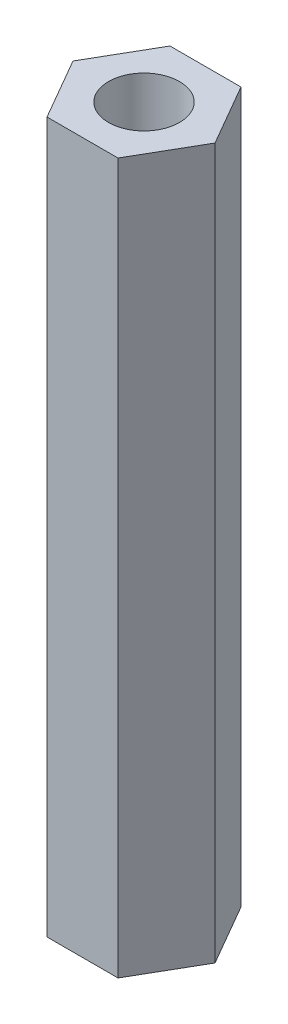
ISO-10303-21;
HEADER;
FILE_DESCRIPTION(('STEP AP214'),'2;1');
FILE_NAME('part.step','',(''),(''),'','','');
FILE_SCHEMA(('AUTOMOTIVE_DESIGN { 1 0 10303 214 1 1 1 1 }'));
ENDSEC;
DATA;
#1=APPLICATION_CONTEXT('core data for automotive mechanical design processes');
#2=APPLICATION_PROTOCOL_DEFINITION('international standard','automotive_design',2000,#1);
#3=PRODUCT_CONTEXT('',#1,'mechanical');
#4=PRODUCT('Part','Part','',(#3));
#5=PRODUCT_RELATED_PRODUCT_CATEGORY('part','',(#4));
#6=PRODUCT_DEFINITION_FORMATION('','',#4);
#7=PRODUCT_DEFINITION_CONTEXT('part definition',#1,'design');
#8=PRODUCT_DEFINITION('design','',#6,#7);
#9=PRODUCT_DEFINITION_SHAPE('','',#8);
#10=(LENGTH_UNIT() NAMED_UNIT(*) SI_UNIT(.MILLI.,.METRE.));
#11=(NAMED_UNIT(*) PLANE_ANGLE_UNIT() SI_UNIT($,.RADIAN.));
#12=(NAMED_UNIT(*) SI_UNIT($,.STERADIAN.) SOLID_ANGLE_UNIT());
#13=UNCERTAINTY_MEASURE_WITH_UNIT(LENGTH_MEASURE(1.E-05),#10,'distance_accuracy_value','');
#14=(GEOMETRIC_REPRESENTATION_CONTEXT(3) GLOBAL_UNCERTAINTY_ASSIGNED_CONTEXT((#13)) GLOBAL_UNIT_ASSIGNED_CONTEXT((#10,
#11,#12)) REPRESENTATION_CONTEXT('',''));
#15=CARTESIAN_POINT('',(0.,0.,0.));
#16=DIRECTION('',(0.,0.,1.));
#17=DIRECTION('',(1.,0.,0.));
#18=AXIS2_PLACEMENT_3D('',#15,#16,#17);
#19=CARTESIAN_POINT('',(0.,5.,0.));
#20=DIRECTION('',(0.,1.,0.));
#21=DIRECTION('',(0.,0.,1.));
#22=AXIS2_PLACEMENT_3D('',#19,#20,#21);
#23=PLANE('',#22);
#24=DIRECTION('',(-1.,0.,0.));
#25=VECTOR('',#24,1.);
#26=CARTESIAN_POINT('',(0.250000761159924,5.,-0.43301402025988));
#27=LINE('',#26,#25);
#28=CARTESIAN_POINT('',(0.250000761159924,5.,-0.43301402025988));
#29=VERTEX_POINT('',#28);
#30=CARTESIAN_POINT('',(-0.250000761159924,5.,-0.43301402025988));
#31=VERTEX_POINT('',#30);
#32=EDGE_CURVE('E131',#29,#31,#27,.T.);
#33=ORIENTED_EDGE('',*,*,#32,.T.);
#34=DIRECTION('',(-0.5,0.,0.866025403784439));
#35=VECTOR('',#34,1.);
#36=CARTESIAN_POINT('',(-0.250000761159924,5.,-0.43301402025988));
#37=LINE('',#36,#35);
#38=CARTESIAN_POINT('',(-0.500001522319847,5.,0.));
#39=VERTEX_POINT('',#38);
#40=EDGE_CURVE('E89',#31,#39,#37,.T.);
#41=ORIENTED_EDGE('',*,*,#40,.T.);
#42=DIRECTION('',(0.5,0.,0.866025403784439));
#43=VECTOR('',#42,1.);
#44=CARTESIAN_POINT('',(-0.500001522319847,5.,0.));
#45=LINE('',#44,#43);
#46=CARTESIAN_POINT('',(-0.250000761159924,5.,0.43301402025988));
#47=VERTEX_POINT('',#46);
#48=EDGE_CURVE('E102',#39,#47,#45,.T.);
#49=ORIENTED_EDGE('',*,*,#48,.T.);
#50=DIRECTION('',(1.,0.,0.));
#51=VECTOR('',#50,1.);
#52=CARTESIAN_POINT('',(-0.250000761159924,5.,0.43301402025988));
#53=LINE('',#52,#51);
#54=CARTESIAN_POINT('',(0.250000761159924,5.,0.43301402025988));
#55=VERTEX_POINT('',#54);
#56=EDGE_CURVE('E96',#47,#55,#53,.T.);
#57=ORIENTED_EDGE('',*,*,#56,.T.);
#58=DIRECTION('',(0.5,0.,-0.866025403784438));
#59=VECTOR('',#58,1.);
#60=CARTESIAN_POINT('',(0.250000761159924,5.,0.43301402025988));
#61=LINE('',#60,#59);
#62=CARTESIAN_POINT('',(0.500001522319848,5.,0.));
#63=VERTEX_POINT('',#62);
#64=EDGE_CURVE('E100',#55,#63,#61,.T.);
#65=ORIENTED_EDGE('',*,*,#64,.T.);
#66=DIRECTION('',(-0.5,0.,-0.866025403784439));
#67=VECTOR('',#66,1.);
#68=CARTESIAN_POINT('',(0.500001522319848,5.,0.));
#69=LINE('',#68,#67);
#70=EDGE_CURVE('E52',#63,#29,#69,.T.);
#71=ORIENTED_EDGE('',*,*,#70,.T.);
#72=EDGE_LOOP('',(#33,#41,#49,#57,#65,#71));
#73=FACE_BOUND('',#72,.T.);
#74=CARTESIAN_POINT('',(0.,5.,0.));
#75=DIRECTION('',(0.,1.,0.));
#76=DIRECTION('',(0.,0.,1.));
#77=AXIS2_PLACEMENT_3D('',#74,#75,#76);
#78=CIRCLE('',#77,0.25);
#79=CARTESIAN_POINT('',(0.,5.,0.25));
#80=VERTEX_POINT('',#79);
#81=EDGE_CURVE('E124',#80,#80,#78,.T.);
#82=ORIENTED_EDGE('',*,*,#81,.F.);
#83=EDGE_LOOP('',(#82));
#84=FACE_BOUND('',#83,.T.);
#85=ADVANCED_FACE('F35',(#73,#84),#23,.T.);
#86=CARTESIAN_POINT('',(0.,0.,0.));
#87=DIRECTION('',(0.,1.,0.));
#88=DIRECTION('',(0.,0.,1.));
#89=AXIS2_PLACEMENT_3D('',#86,#87,#88);
#90=PLANE('',#89);
#91=DIRECTION('',(-1.,0.,0.));
#92=VECTOR('',#91,1.);
#93=CARTESIAN_POINT('',(0.250000761159924,0.,-0.43301402025988));
#94=LINE('',#93,#92);
#95=CARTESIAN_POINT('',(0.250000761159924,0.,-0.43301402025988));
#96=VERTEX_POINT('',#95);
#97=CARTESIAN_POINT('',(-0.250000761159924,0.,-0.43301402025988));
#98=VERTEX_POINT('',#97);
#99=EDGE_CURVE('E120',#96,#98,#94,.T.);
#100=ORIENTED_EDGE('',*,*,#99,.F.);
#101=DIRECTION('',(-0.5,0.,-0.866025403784439));
#102=VECTOR('',#101,1.);
#103=CARTESIAN_POINT('',(0.500001522319848,0.,0.));
#104=LINE('',#103,#102);
#105=CARTESIAN_POINT('',(0.500001522319848,0.,0.));
#106=VERTEX_POINT('',#105);
#107=EDGE_CURVE('E81',#106,#96,#104,.T.);
#108=ORIENTED_EDGE('',*,*,#107,.F.);
#109=DIRECTION('',(0.5,0.,-0.866025403784438));
#110=VECTOR('',#109,1.);
#111=CARTESIAN_POINT('',(0.250000761159924,0.,0.43301402025988));
#112=LINE('',#111,#110);
#113=CARTESIAN_POINT('',(0.250000761159924,0.,0.43301402025988));
#114=VERTEX_POINT('',#113);
#115=EDGE_CURVE('E75',#114,#106,#112,.T.);
#116=ORIENTED_EDGE('',*,*,#115,.F.);
#117=DIRECTION('',(1.,0.,0.));
#118=VECTOR('',#117,1.);
#119=CARTESIAN_POINT('',(-0.250000761159924,0.,0.43301402025988));
#120=LINE('',#119,#118);
#121=CARTESIAN_POINT('',(-0.250000761159924,0.,0.43301402025988));
#122=VERTEX_POINT('',#121);
#123=EDGE_CURVE('E110',#122,#114,#120,.T.);
#124=ORIENTED_EDGE('',*,*,#123,.F.);
#125=DIRECTION('',(0.5,0.,0.866025403784439));
#126=VECTOR('',#125,1.);
#127=CARTESIAN_POINT('',(-0.500001522319847,0.,0.));
#128=LINE('',#127,#126);
#129=CARTESIAN_POINT('',(-0.500001522319847,0.,0.));
#130=VERTEX_POINT('',#129);
#131=EDGE_CURVE('E126',#130,#122,#128,.T.);
#132=ORIENTED_EDGE('',*,*,#131,.F.);
#133=DIRECTION('',(-0.5,0.,0.866025403784439));
#134=VECTOR('',#133,1.);
#135=CARTESIAN_POINT('',(-0.250000761159924,0.,-0.43301402025988));
#136=LINE('',#135,#134);
#137=EDGE_CURVE('E123',#98,#130,#136,.T.);
#138=ORIENTED_EDGE('',*,*,#137,.F.);
#139=EDGE_LOOP('',(#100,#108,#116,#124,#132,#138));
#140=FACE_BOUND('',#139,.T.);
#141=CARTESIAN_POINT('',(0.,0.,0.));
#142=DIRECTION('',(0.,1.,0.));
#143=DIRECTION('',(0.,0.,1.));
#144=AXIS2_PLACEMENT_3D('',#141,#142,#143);
#145=CIRCLE('',#144,0.25);
#146=CARTESIAN_POINT('',(0.,0.,0.25));
#147=VERTEX_POINT('',#146);
#148=EDGE_CURVE('E224',#147,#147,#145,.T.);
#149=ORIENTED_EDGE('',*,*,#148,.T.);
#150=EDGE_LOOP('',(#149));
#151=FACE_BOUND('',#150,.T.);
#152=ADVANCED_FACE('F140',(#140,#151),#90,.F.);
#153=CARTESIAN_POINT('',(0.250000761159924,5.,-0.43301402025988));
#154=DIRECTION('',(0.,0.,1.));
#155=DIRECTION('',(1.,0.,0.));
#156=AXIS2_PLACEMENT_3D('',#153,#154,#155);
#157=PLANE('',#156);
#158=ORIENTED_EDGE('',*,*,#99,.T.);
#159=DIRECTION('',(0.,-1.,0.));
#160=VECTOR('',#159,1.);
#161=CARTESIAN_POINT('',(-0.250000761159924,5.,-0.43301402025988));
#162=LINE('',#161,#160);
#163=EDGE_CURVE('E11',#31,#98,#162,.T.);
#164=ORIENTED_EDGE('',*,*,#163,.F.);
#165=ORIENTED_EDGE('',*,*,#32,.F.);
#166=DIRECTION('',(0.,-1.,0.));
#167=VECTOR('',#166,1.);
#168=CARTESIAN_POINT('',(0.250000761159924,5.,-0.43301402025988));
#169=LINE('',#168,#167);
#170=EDGE_CURVE('E116',#29,#96,#169,.T.);
#171=ORIENTED_EDGE('',*,*,#170,.T.);
#172=EDGE_LOOP('',(#158,#164,#165,#171));
#173=FACE_BOUND('',#172,.T.);
#174=ADVANCED_FACE('F37',(#173),#157,.F.);
#175=CARTESIAN_POINT('',(-0.250000761159924,5.,-0.43301402025988));
#176=DIRECTION('',(0.866025403784439,0.,0.5));
#177=DIRECTION('',(0.5,0.,-0.866025403784439));
#178=AXIS2_PLACEMENT_3D('',#175,#176,#177);
#179=PLANE('',#178);
#180=ORIENTED_EDGE('',*,*,#137,.T.);
#181=DIRECTION('',(0.,-1.,0.));
#182=VECTOR('',#181,1.);
#183=CARTESIAN_POINT('',(-0.500001522319847,5.,0.));
#184=LINE('',#183,#182);
#185=EDGE_CURVE('E44',#39,#130,#184,.T.);
#186=ORIENTED_EDGE('',*,*,#185,.F.);
#187=ORIENTED_EDGE('',*,*,#40,.F.);
#188=ORIENTED_EDGE('',*,*,#163,.T.);
#189=EDGE_LOOP('',(#180,#186,#187,#188));
#190=FACE_BOUND('',#189,.T.);
#191=ADVANCED_FACE('F165',(#190),#179,.F.);
#192=CARTESIAN_POINT('',(-0.500001522319847,5.,0.));
#193=DIRECTION('',(0.866025403784439,0.,-0.5));
#194=DIRECTION('',(-0.5,0.,-0.866025403784439));
#195=AXIS2_PLACEMENT_3D('',#192,#193,#194);
#196=PLANE('',#195);
#197=ORIENTED_EDGE('',*,*,#131,.T.);
#198=DIRECTION('',(0.,-1.,0.));
#199=VECTOR('',#198,1.);
#200=CARTESIAN_POINT('',(-0.250000761159924,5.,0.43301402025988));
#201=LINE('',#200,#199);
#202=EDGE_CURVE('E111',#47,#122,#201,.T.);
#203=ORIENTED_EDGE('',*,*,#202,.F.);
#204=ORIENTED_EDGE('',*,*,#48,.F.);
#205=ORIENTED_EDGE('',*,*,#185,.T.);
#206=EDGE_LOOP('',(#197,#203,#204,#205));
#207=FACE_BOUND('',#206,.T.);
#208=ADVANCED_FACE('F137',(#207),#196,.F.);
#209=CARTESIAN_POINT('',(-0.250000761159924,5.,0.43301402025988));
#210=DIRECTION('',(0.,0.,-1.));
#211=DIRECTION('',(-1.,0.,0.));
#212=AXIS2_PLACEMENT_3D('',#209,#210,#211);
#213=PLANE('',#212);
#214=ORIENTED_EDGE('',*,*,#123,.T.);
#215=DIRECTION('',(0.,-1.,0.));
#216=VECTOR('',#215,1.);
#217=CARTESIAN_POINT('',(0.250000761159924,5.,0.43301402025988));
#218=LINE('',#217,#216);
#219=EDGE_CURVE('E107',#55,#114,#218,.T.);
#220=ORIENTED_EDGE('',*,*,#219,.F.);
#221=ORIENTED_EDGE('',*,*,#56,.F.);
#222=ORIENTED_EDGE('',*,*,#202,.T.);
#223=EDGE_LOOP('',(#214,#220,#221,#222));
#224=FACE_BOUND('',#223,.T.);
#225=ADVANCED_FACE('F108',(#224),#213,.F.);
#226=CARTESIAN_POINT('',(0.250000761159924,5.,0.43301402025988));
#227=DIRECTION('',(-0.866025403784438,0.,-0.5));
#228=DIRECTION('',(-0.5,0.,0.866025403784438));
#229=AXIS2_PLACEMENT_3D('',#226,#227,#228);
#230=PLANE('',#229);
#231=ORIENTED_EDGE('',*,*,#115,.T.);
#232=DIRECTION('',(0.,-1.,0.));
#233=VECTOR('',#232,1.);
#234=CARTESIAN_POINT('',(0.500001522319848,5.,0.));
#235=LINE('',#234,#233);
#236=EDGE_CURVE('E112',#63,#106,#235,.T.);
#237=ORIENTED_EDGE('',*,*,#236,.F.);
#238=ORIENTED_EDGE('',*,*,#64,.F.);
#239=ORIENTED_EDGE('',*,*,#219,.T.);
#240=EDGE_LOOP('',(#231,#237,#238,#239));
#241=FACE_BOUND('',#240,.T.);
#242=ADVANCED_FACE('F114',(#241),#230,.F.);
#243=CARTESIAN_POINT('',(0.500001522319848,5.,0.));
#244=DIRECTION('',(-0.866025403784439,0.,0.5));
#245=DIRECTION('',(0.5,0.,0.866025403784439));
#246=AXIS2_PLACEMENT_3D('',#243,#244,#245);
#247=PLANE('',#246);
#248=ORIENTED_EDGE('',*,*,#107,.T.);
#249=ORIENTED_EDGE('',*,*,#170,.F.);
#250=ORIENTED_EDGE('',*,*,#70,.F.);
#251=ORIENTED_EDGE('',*,*,#236,.T.);
#252=EDGE_LOOP('',(#248,#249,#250,#251));
#253=FACE_BOUND('',#252,.T.);
#254=ADVANCED_FACE('F145',(#253),#247,.F.);
#255=CARTESIAN_POINT('',(0.,5.,0.));
#256=DIRECTION('',(0.,-1.,0.));
#257=DIRECTION('',(0.,0.,-1.));
#258=AXIS2_PLACEMENT_3D('',#255,#256,#257);
#259=CYLINDRICAL_SURFACE('',#258,0.25);
#260=ORIENTED_EDGE('',*,*,#81,.T.);
#261=EDGE_LOOP('',(#260));
#262=FACE_BOUND('',#261,.T.);
#263=ORIENTED_EDGE('',*,*,#148,.F.);
#264=EDGE_LOOP('',(#263));
#265=FACE_BOUND('',#264,.T.);
#266=ADVANCED_FACE('F147',(#262,#265),#259,.F.);
#267=CLOSED_SHELL('',(#85,#152,#174,#191,#208,#225,#242,#254,#266));
#268=MANIFOLD_SOLID_BREP('B2',#267);
#269=ADVANCED_BREP_SHAPE_REPRESENTATION('',(#18,#268),#14);
#270=SHAPE_DEFINITION_REPRESENTATION(#9,#269);
ENDSEC;
END-ISO-10303-21;
